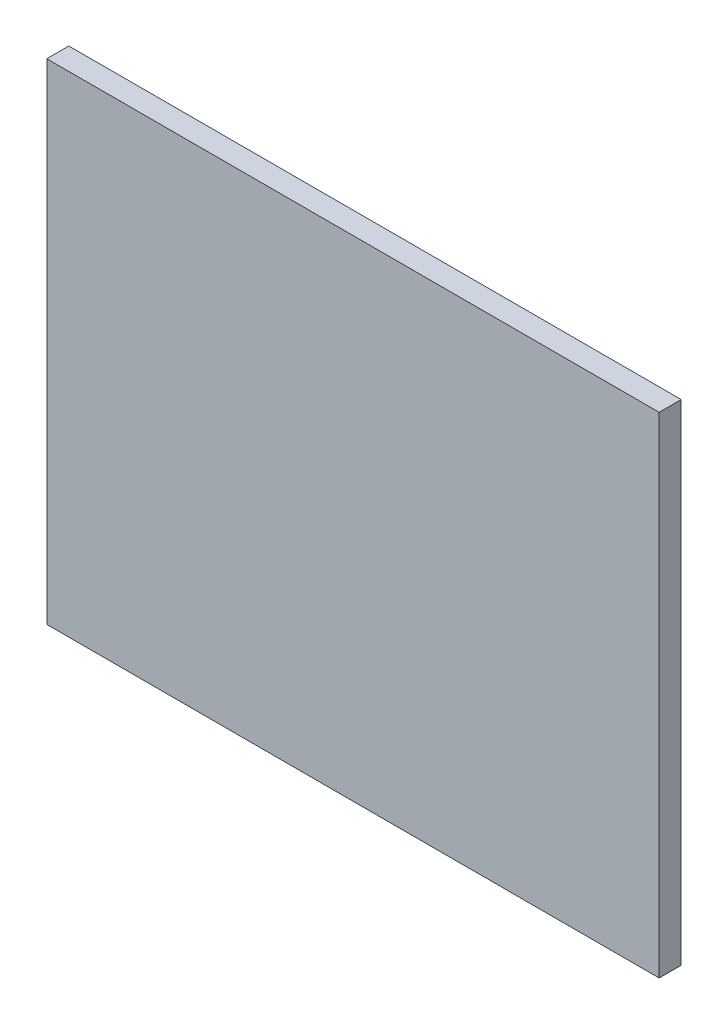
ISO-10303-21;
HEADER;
FILE_DESCRIPTION(('STEP AP214'),'2;1');
FILE_NAME('part.step','',(''),(''),'','','');
FILE_SCHEMA(('AUTOMOTIVE_DESIGN { 1 0 10303 214 1 1 1 1 }'));
ENDSEC;
DATA;
#1=APPLICATION_CONTEXT('core data for automotive mechanical design processes');
#2=APPLICATION_PROTOCOL_DEFINITION('international standard','automotive_design',2000,#1);
#3=PRODUCT_CONTEXT('',#1,'mechanical');
#4=PRODUCT('Part','Part','',(#3));
#5=PRODUCT_RELATED_PRODUCT_CATEGORY('part','',(#4));
#6=PRODUCT_DEFINITION_FORMATION('','',#4);
#7=PRODUCT_DEFINITION_CONTEXT('part definition',#1,'design');
#8=PRODUCT_DEFINITION('design','',#6,#7);
#9=PRODUCT_DEFINITION_SHAPE('','',#8);
#10=(LENGTH_UNIT() NAMED_UNIT(*) SI_UNIT(.MILLI.,.METRE.));
#11=(NAMED_UNIT(*) PLANE_ANGLE_UNIT() SI_UNIT($,.RADIAN.));
#12=(NAMED_UNIT(*) SI_UNIT($,.STERADIAN.) SOLID_ANGLE_UNIT());
#13=UNCERTAINTY_MEASURE_WITH_UNIT(LENGTH_MEASURE(1.E-05),#10,'distance_accuracy_value','');
#14=(GEOMETRIC_REPRESENTATION_CONTEXT(3) GLOBAL_UNCERTAINTY_ASSIGNED_CONTEXT((#13)) GLOBAL_UNIT_ASSIGNED_CONTEXT((#10,
#11,#12)) REPRESENTATION_CONTEXT('',''));
#15=CARTESIAN_POINT('',(0.,0.,0.));
#16=DIRECTION('',(0.,0.,1.));
#17=DIRECTION('',(1.,0.,0.));
#18=AXIS2_PLACEMENT_3D('',#15,#16,#17);
#19=CARTESIAN_POINT('',(250.,200.,18.));
#20=DIRECTION('',(-1.,0.,0.));
#21=DIRECTION('',(0.,-1.,0.));
#22=AXIS2_PLACEMENT_3D('',#19,#20,#21);
#23=PLANE('',#22);
#24=DIRECTION('',(0.,1.,0.));
#25=VECTOR('',#24,1.);
#26=CARTESIAN_POINT('',(250.,200.,0.));
#27=LINE('',#26,#25);
#28=CARTESIAN_POINT('',(250.,-200.,0.));
#29=VERTEX_POINT('',#28);
#30=CARTESIAN_POINT('',(250.,200.,0.));
#31=VERTEX_POINT('',#30);
#32=EDGE_CURVE('E96',#29,#31,#27,.T.);
#33=ORIENTED_EDGE('',*,*,#32,.T.);
#34=DIRECTION('',(0.,0.,-1.));
#35=VECTOR('',#34,1.);
#36=CARTESIAN_POINT('',(250.,200.,18.));
#37=LINE('',#36,#35);
#38=CARTESIAN_POINT('',(250.,200.,18.));
#39=VERTEX_POINT('',#38);
#40=EDGE_CURVE('E11',#39,#31,#37,.T.);
#41=ORIENTED_EDGE('',*,*,#40,.F.);
#42=DIRECTION('',(0.,1.,0.));
#43=VECTOR('',#42,1.);
#44=CARTESIAN_POINT('',(250.,200.,18.));
#45=LINE('',#44,#43);
#46=CARTESIAN_POINT('',(250.,-200.,18.));
#47=VERTEX_POINT('',#46);
#48=EDGE_CURVE('E84',#47,#39,#45,.T.);
#49=ORIENTED_EDGE('',*,*,#48,.F.);
#50=DIRECTION('',(0.,0.,-1.));
#51=VECTOR('',#50,1.);
#52=CARTESIAN_POINT('',(250.,-200.,18.));
#53=LINE('',#52,#51);
#54=EDGE_CURVE('E92',#47,#29,#53,.T.);
#55=ORIENTED_EDGE('',*,*,#54,.T.);
#56=EDGE_LOOP('',(#33,#41,#49,#55));
#57=FACE_BOUND('',#56,.T.);
#58=ADVANCED_FACE('F33',(#57),#23,.F.);
#59=CARTESIAN_POINT('',(-250.,200.,18.));
#60=DIRECTION('',(0.,-1.,0.));
#61=DIRECTION('',(0.,0.,-1.));
#62=AXIS2_PLACEMENT_3D('',#59,#60,#61);
#63=PLANE('',#62);
#64=DIRECTION('',(-1.,0.,0.));
#65=VECTOR('',#64,1.);
#66=CARTESIAN_POINT('',(-250.,200.,0.));
#67=LINE('',#66,#65);
#68=CARTESIAN_POINT('',(-250.,200.,0.));
#69=VERTEX_POINT('',#68);
#70=EDGE_CURVE('E88',#31,#69,#67,.T.);
#71=ORIENTED_EDGE('',*,*,#70,.T.);
#72=DIRECTION('',(0.,0.,-1.));
#73=VECTOR('',#72,1.);
#74=CARTESIAN_POINT('',(-250.,200.,18.));
#75=LINE('',#74,#73);
#76=CARTESIAN_POINT('',(-250.,200.,18.));
#77=VERTEX_POINT('',#76);
#78=EDGE_CURVE('E41',#77,#69,#75,.T.);
#79=ORIENTED_EDGE('',*,*,#78,.F.);
#80=DIRECTION('',(-1.,0.,0.));
#81=VECTOR('',#80,1.);
#82=CARTESIAN_POINT('',(-250.,200.,18.));
#83=LINE('',#82,#81);
#84=EDGE_CURVE('E79',#39,#77,#83,.T.);
#85=ORIENTED_EDGE('',*,*,#84,.F.);
#86=ORIENTED_EDGE('',*,*,#40,.T.);
#87=EDGE_LOOP('',(#71,#79,#85,#86));
#88=FACE_BOUND('',#87,.T.);
#89=ADVANCED_FACE('F87',(#88),#63,.F.);
#90=CARTESIAN_POINT('',(-250.,200.,18.));
#91=DIRECTION('',(1.,0.,0.));
#92=DIRECTION('',(0.,0.,-1.));
#93=AXIS2_PLACEMENT_3D('',#90,#91,#92);
#94=PLANE('',#93);
#95=DIRECTION('',(0.,-1.,0.));
#96=VECTOR('',#95,1.);
#97=CARTESIAN_POINT('',(-250.,200.,0.));
#98=LINE('',#97,#96);
#99=CARTESIAN_POINT('',(-250.,-200.,0.));
#100=VERTEX_POINT('',#99);
#101=EDGE_CURVE('E66',#69,#100,#98,.T.);
#102=ORIENTED_EDGE('',*,*,#101,.T.);
#103=DIRECTION('',(0.,0.,-1.));
#104=VECTOR('',#103,1.);
#105=CARTESIAN_POINT('',(-250.,-200.,18.));
#106=LINE('',#105,#104);
#107=CARTESIAN_POINT('',(-250.,-200.,18.));
#108=VERTEX_POINT('',#107);
#109=EDGE_CURVE('E89',#108,#100,#106,.T.);
#110=ORIENTED_EDGE('',*,*,#109,.F.);
#111=DIRECTION('',(0.,-1.,0.));
#112=VECTOR('',#111,1.);
#113=CARTESIAN_POINT('',(-250.,200.,18.));
#114=LINE('',#113,#112);
#115=EDGE_CURVE('E82',#77,#108,#114,.T.);
#116=ORIENTED_EDGE('',*,*,#115,.F.);
#117=ORIENTED_EDGE('',*,*,#78,.T.);
#118=EDGE_LOOP('',(#102,#110,#116,#117));
#119=FACE_BOUND('',#118,.T.);
#120=ADVANCED_FACE('F90',(#119),#94,.F.);
#121=CARTESIAN_POINT('',(-250.,-200.,18.));
#122=DIRECTION('',(0.,1.,0.));
#123=DIRECTION('',(0.,0.,1.));
#124=AXIS2_PLACEMENT_3D('',#121,#122,#123);
#125=PLANE('',#124);
#126=DIRECTION('',(1.,0.,0.));
#127=VECTOR('',#126,1.);
#128=CARTESIAN_POINT('',(-250.,-200.,0.));
#129=LINE('',#128,#127);
#130=EDGE_CURVE('E72',#100,#29,#129,.T.);
#131=ORIENTED_EDGE('',*,*,#130,.T.);
#132=ORIENTED_EDGE('',*,*,#54,.F.);
#133=DIRECTION('',(1.,0.,0.));
#134=VECTOR('',#133,1.);
#135=CARTESIAN_POINT('',(-250.,-200.,18.));
#136=LINE('',#135,#134);
#137=EDGE_CURVE('E49',#108,#47,#136,.T.);
#138=ORIENTED_EDGE('',*,*,#137,.F.);
#139=ORIENTED_EDGE('',*,*,#109,.T.);
#140=EDGE_LOOP('',(#131,#132,#138,#139));
#141=FACE_BOUND('',#140,.T.);
#142=ADVANCED_FACE('F103',(#141),#125,.F.);
#143=CARTESIAN_POINT('',(0.,0.,18.));
#144=DIRECTION('',(0.,0.,1.));
#145=DIRECTION('',(1.,0.,0.));
#146=AXIS2_PLACEMENT_3D('',#143,#144,#145);
#147=PLANE('',#146);
#148=ORIENTED_EDGE('',*,*,#48,.T.);
#149=ORIENTED_EDGE('',*,*,#84,.T.);
#150=ORIENTED_EDGE('',*,*,#115,.T.);
#151=ORIENTED_EDGE('',*,*,#137,.T.);
#152=EDGE_LOOP('',(#148,#149,#150,#151));
#153=FACE_BOUND('',#152,.T.);
#154=ADVANCED_FACE('F80',(#153),#147,.T.);
#155=CARTESIAN_POINT('',(0.,0.,0.));
#156=DIRECTION('',(0.,0.,1.));
#157=DIRECTION('',(1.,0.,0.));
#158=AXIS2_PLACEMENT_3D('',#155,#156,#157);
#159=PLANE('',#158);
#160=ORIENTED_EDGE('',*,*,#32,.F.);
#161=ORIENTED_EDGE('',*,*,#130,.F.);
#162=ORIENTED_EDGE('',*,*,#101,.F.);
#163=ORIENTED_EDGE('',*,*,#70,.F.);
#164=EDGE_LOOP('',(#160,#161,#162,#163));
#165=FACE_BOUND('',#164,.T.);
#166=ADVANCED_FACE('F106',(#165),#159,.F.);
#167=CLOSED_SHELL('',(#58,#89,#120,#142,#154,#166));
#168=MANIFOLD_SOLID_BREP('B2',#167);
#169=ADVANCED_BREP_SHAPE_REPRESENTATION('',(#18,#168),#14);
#170=SHAPE_DEFINITION_REPRESENTATION(#9,#169);
ENDSEC;
END-ISO-10303-21;
